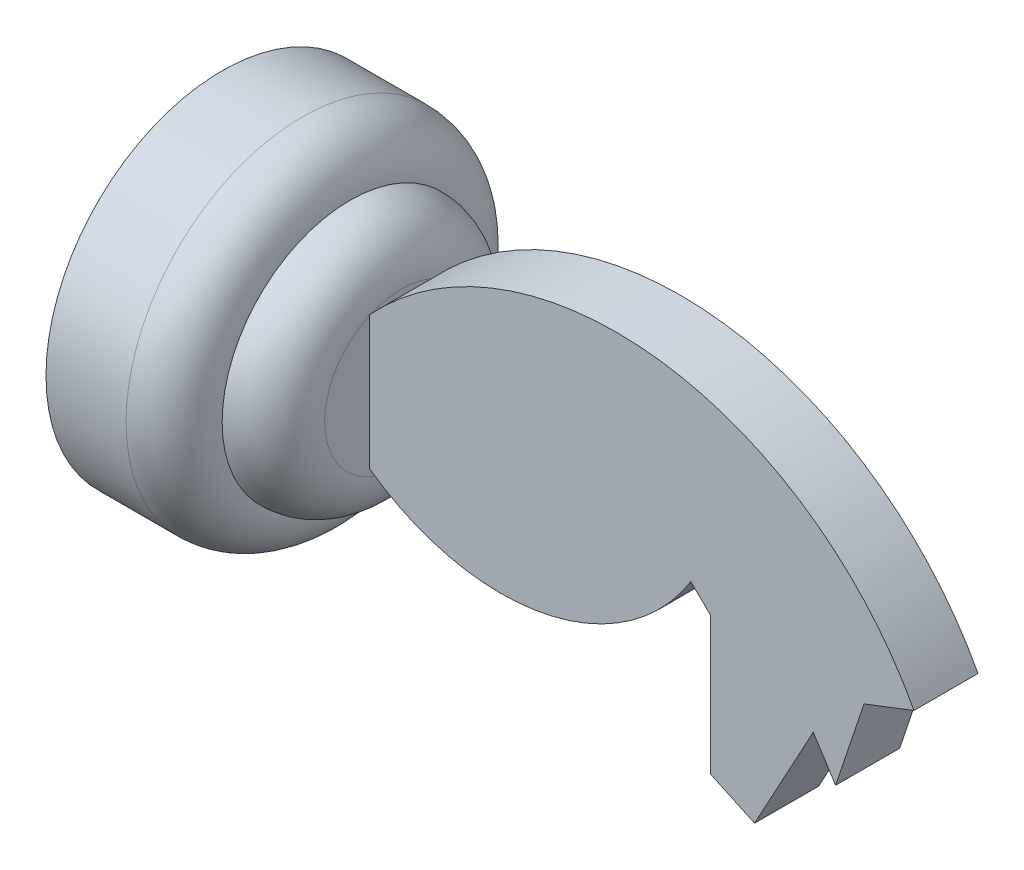
ISO-10303-21;
HEADER;
FILE_DESCRIPTION(('STEP AP214'),'2;1');
FILE_NAME('part.step','',(''),(''),'','','');
FILE_SCHEMA(('AUTOMOTIVE_DESIGN { 1 0 10303 214 1 1 1 1 }'));
ENDSEC;
DATA;
#1=APPLICATION_CONTEXT('core data for automotive mechanical design processes');
#2=APPLICATION_PROTOCOL_DEFINITION('international standard','automotive_design',2000,#1);
#3=PRODUCT_CONTEXT('',#1,'mechanical');
#4=PRODUCT('Part','Part','',(#3));
#5=PRODUCT_RELATED_PRODUCT_CATEGORY('part','',(#4));
#6=PRODUCT_DEFINITION_FORMATION('','',#4);
#7=PRODUCT_DEFINITION_CONTEXT('part definition',#1,'design');
#8=PRODUCT_DEFINITION('design','',#6,#7);
#9=PRODUCT_DEFINITION_SHAPE('','',#8);
#10=(LENGTH_UNIT() NAMED_UNIT(*) SI_UNIT(.MILLI.,.METRE.));
#11=(NAMED_UNIT(*) PLANE_ANGLE_UNIT() SI_UNIT($,.RADIAN.));
#12=(NAMED_UNIT(*) SI_UNIT($,.STERADIAN.) SOLID_ANGLE_UNIT());
#13=UNCERTAINTY_MEASURE_WITH_UNIT(LENGTH_MEASURE(1.E-05),#10,'distance_accuracy_value','');
#14=(GEOMETRIC_REPRESENTATION_CONTEXT(3) GLOBAL_UNCERTAINTY_ASSIGNED_CONTEXT((#13)) GLOBAL_UNIT_ASSIGNED_CONTEXT((#10,
#11,#12)) REPRESENTATION_CONTEXT('',''));
#15=CARTESIAN_POINT('',(0.,0.,0.));
#16=DIRECTION('',(0.,0.,1.));
#17=DIRECTION('',(1.,0.,0.));
#18=AXIS2_PLACEMENT_3D('',#15,#16,#17);
#19=CARTESIAN_POINT('',(11.2,0.,0.));
#20=DIRECTION('',(1.,0.,0.));
#21=DIRECTION('',(0.,0.,-1.));
#22=AXIS2_PLACEMENT_3D('',#19,#20,#21);
#23=PLANE('',#22);
#24=DIRECTION('',(0.,0.,-1.));
#25=VECTOR('',#24,1.);
#26=CARTESIAN_POINT('',(11.2,4.4,2.));
#27=LINE('',#26,#25);
#28=CARTESIAN_POINT('',(11.2,4.4,1.91833260932509));
#29=VERTEX_POINT('',#28);
#30=CARTESIAN_POINT('',(11.2,4.4,-1.91833260932509));
#31=VERTEX_POINT('',#30);
#32=EDGE_CURVE('E155',#29,#31,#27,.T.);
#33=ORIENTED_EDGE('',*,*,#32,.T.);
#34=CARTESIAN_POINT('',(11.2,0.,0.));
#35=DIRECTION('',(-1.,0.,0.));
#36=DIRECTION('',(0.,0.,1.));
#37=AXIS2_PLACEMENT_3D('',#34,#35,#36);
#38=CIRCLE('',#37,4.8);
#39=EDGE_CURVE('E55',#29,#31,#38,.T.);
#40=ORIENTED_EDGE('',*,*,#39,.F.);
#41=EDGE_LOOP('',(#33,#40));
#42=FACE_BOUND('',#41,.T.);
#43=ADVANCED_FACE('F46',(#42),#23,.T.);
#44=DIRECTION('',(0.,1.,0.));
#45=VECTOR('',#44,1.);
#46=CARTESIAN_POINT('',(11.2,0.,2.));
#47=LINE('',#46,#45);
#48=CARTESIAN_POINT('',(11.2,-3.91497825520678,2.));
#49=VERTEX_POINT('',#48);
#50=CARTESIAN_POINT('',(11.2,4.36348484585429,2.));
#51=VERTEX_POINT('',#50);
#52=EDGE_CURVE('E147',#49,#51,#47,.T.);
#53=ORIENTED_EDGE('',*,*,#52,.T.);
#54=CARTESIAN_POINT('',(11.2,4.36348484585429,-2.));
#55=VERTEX_POINT('',#54);
#56=EDGE_CURVE('E56',#55,#51,#38,.T.);
#57=ORIENTED_EDGE('',*,*,#56,.F.);
#58=DIRECTION('',(0.,1.,0.));
#59=VECTOR('',#58,1.);
#60=CARTESIAN_POINT('',(11.2,0.,-2.));
#61=LINE('',#60,#59);
#62=CARTESIAN_POINT('',(11.2,-3.91497825520678,-2.));
#63=VERTEX_POINT('',#62);
#64=EDGE_CURVE('E63',#63,#55,#61,.T.);
#65=ORIENTED_EDGE('',*,*,#64,.F.);
#66=DIRECTION('',(0.,0.,-1.));
#67=VECTOR('',#66,1.);
#68=CARTESIAN_POINT('',(11.2,-3.91497825520678,2.));
#69=LINE('',#68,#67);
#70=EDGE_CURVE('E225',#49,#63,#69,.T.);
#71=ORIENTED_EDGE('',*,*,#70,.F.);
#72=EDGE_LOOP('',(#53,#57,#65,#71));
#73=FACE_BOUND('',#72,.T.);
#74=ADVANCED_FACE('F48',(#73),#23,.T.);
#75=CARTESIAN_POINT('',(8.,0.,0.));
#76=DIRECTION('',(-1.,0.,0.));
#77=DIRECTION('',(0.,0.,1.));
#78=AXIS2_PLACEMENT_3D('',#75,#76,#77);
#79=TOROIDAL_SURFACE('',#78,4.8,3.2);
#80=CARTESIAN_POINT('',(8.,0.,0.));
#81=DIRECTION('',(-1.,0.,0.));
#82=DIRECTION('',(0.,0.,1.));
#83=AXIS2_PLACEMENT_3D('',#80,#81,#82);
#84=CIRCLE('',#83,8.);
#85=CARTESIAN_POINT('',(8.,0.,8.));
#86=VERTEX_POINT('',#85);
#87=EDGE_CURVE('E237',#86,#86,#84,.T.);
#88=ORIENTED_EDGE('',*,*,#87,.F.);
#89=EDGE_LOOP('',(#88));
#90=FACE_BOUND('',#89,.T.);
#91=EDGE_CURVE('E11',#51,#29,#38,.T.);
#92=ORIENTED_EDGE('',*,*,#91,.T.);
#93=ORIENTED_EDGE('',*,*,#39,.T.);
#94=EDGE_CURVE('E70',#31,#55,#38,.T.);
#95=ORIENTED_EDGE('',*,*,#94,.T.);
#96=ORIENTED_EDGE('',*,*,#56,.T.);
#97=EDGE_LOOP('',(#92,#93,#95,#96));
#98=FACE_BOUND('',#97,.T.);
#99=ADVANCED_FACE('F245',(#90,#98),#79,.T.);
#100=CARTESIAN_POINT('',(5.,0.,0.));
#101=DIRECTION('',(-1.,0.,0.));
#102=DIRECTION('',(0.,0.,1.));
#103=AXIS2_PLACEMENT_3D('',#100,#101,#102);
#104=TOROIDAL_SURFACE('',#103,8.,3.);
#105=CARTESIAN_POINT('',(5.,0.,0.));
#106=DIRECTION('',(-1.,0.,0.));
#107=DIRECTION('',(0.,0.,1.));
#108=AXIS2_PLACEMENT_3D('',#105,#106,#107);
#109=CIRCLE('',#108,11.);
#110=CARTESIAN_POINT('',(5.,0.,11.));
#111=VERTEX_POINT('',#110);
#112=EDGE_CURVE('E235',#111,#111,#109,.T.);
#113=ORIENTED_EDGE('',*,*,#112,.F.);
#114=EDGE_LOOP('',(#113));
#115=FACE_BOUND('',#114,.T.);
#116=ORIENTED_EDGE('',*,*,#87,.T.);
#117=EDGE_LOOP('',(#116));
#118=FACE_BOUND('',#117,.T.);
#119=ADVANCED_FACE('F293',(#115,#118),#104,.T.);
#120=CARTESIAN_POINT('',(0.,0.,0.));
#121=DIRECTION('',(-1.,0.,0.));
#122=DIRECTION('',(0.,0.,1.));
#123=AXIS2_PLACEMENT_3D('',#120,#121,#122);
#124=CYLINDRICAL_SURFACE('',#123,11.);
#125=ORIENTED_EDGE('',*,*,#112,.T.);
#126=EDGE_LOOP('',(#125));
#127=FACE_BOUND('',#126,.T.);
#128=CARTESIAN_POINT('',(0.,0.,0.));
#129=DIRECTION('',(-1.,0.,0.));
#130=DIRECTION('',(0.,0.,1.));
#131=AXIS2_PLACEMENT_3D('',#128,#129,#130);
#132=CIRCLE('',#131,11.);
#133=CARTESIAN_POINT('',(0.,0.,11.));
#134=VERTEX_POINT('',#133);
#135=EDGE_CURVE('E232',#134,#134,#132,.T.);
#136=ORIENTED_EDGE('',*,*,#135,.F.);
#137=EDGE_LOOP('',(#136));
#138=FACE_BOUND('',#137,.T.);
#139=ADVANCED_FACE('F334',(#127,#138),#124,.T.);
#140=CARTESIAN_POINT('',(0.,0.,0.));
#141=DIRECTION('',(-1.,0.,0.));
#142=DIRECTION('',(0.,0.,1.));
#143=AXIS2_PLACEMENT_3D('',#140,#141,#142);
#144=PLANE('',#143);
#145=ORIENTED_EDGE('',*,*,#135,.T.);
#146=EDGE_LOOP('',(#145));
#147=FACE_BOUND('',#146,.T.);
#148=ADVANCED_FACE('F331',(#147),#144,.T.);
#149=CARTESIAN_POINT('',(11.2,0.,2.));
#150=DIRECTION('',(-1.,0.,0.));
#151=DIRECTION('',(0.,0.,1.));
#152=AXIS2_PLACEMENT_3D('',#149,#150,#151);
#153=PLANE('',#152);
#154=ORIENTED_EDGE('',*,*,#91,.F.);
#155=CARTESIAN_POINT('',(11.2,4.4,2.));
#156=VERTEX_POINT('',#155);
#157=EDGE_CURVE('E139',#51,#156,#47,.T.);
#158=ORIENTED_EDGE('',*,*,#157,.T.);
#159=EDGE_CURVE('E142',#156,#29,#27,.T.);
#160=ORIENTED_EDGE('',*,*,#159,.T.);
#161=EDGE_LOOP('',(#154,#158,#160));
#162=FACE_BOUND('',#161,.T.);
#163=ADVANCED_FACE('F141',(#162),#153,.T.);
#164=CARTESIAN_POINT('',(26.6430950023222,-9.83062952751044,2.));
#165=DIRECTION('',(0.,0.,-1.));
#166=DIRECTION('',(-1.,0.,0.));
#167=AXIS2_PLACEMENT_3D('',#164,#165,#166);
#168=CYLINDRICAL_SURFACE('',#167,21.);
#169=CARTESIAN_POINT('',(26.6430950023222,-9.83062952751044,-2.));
#170=DIRECTION('',(0.,0.,1.));
#171=DIRECTION('',(1.,0.,0.));
#172=AXIS2_PLACEMENT_3D('',#169,#170,#171);
#173=CIRCLE('',#172,21.);
#174=CARTESIAN_POINT('',(11.2,4.4,-2.));
#175=VERTEX_POINT('',#174);
#176=CARTESIAN_POINT('',(45.2,0.,-2.));
#177=VERTEX_POINT('',#176);
#178=EDGE_CURVE('E186',#175,#177,#173,.F.);
#179=ORIENTED_EDGE('',*,*,#178,.F.);
#180=EDGE_CURVE('E158',#31,#175,#27,.T.);
#181=ORIENTED_EDGE('',*,*,#180,.F.);
#182=ORIENTED_EDGE('',*,*,#32,.F.);
#183=ORIENTED_EDGE('',*,*,#159,.F.);
#184=CARTESIAN_POINT('',(26.6430950023222,-9.83062952751044,2.));
#185=DIRECTION('',(0.,0.,1.));
#186=DIRECTION('',(1.,0.,0.));
#187=AXIS2_PLACEMENT_3D('',#184,#185,#186);
#188=CIRCLE('',#187,21.);
#189=CARTESIAN_POINT('',(45.2,0.,2.));
#190=VERTEX_POINT('',#189);
#191=EDGE_CURVE('E148',#156,#190,#188,.F.);
#192=ORIENTED_EDGE('',*,*,#191,.T.);
#193=DIRECTION('',(0.,0.,-1.));
#194=VECTOR('',#193,1.);
#195=CARTESIAN_POINT('',(45.2,0.,2.));
#196=LINE('',#195,#194);
#197=EDGE_CURVE('E185',#190,#177,#196,.T.);
#198=ORIENTED_EDGE('',*,*,#197,.T.);
#199=EDGE_LOOP('',(#179,#181,#182,#183,#192,#198));
#200=FACE_BOUND('',#199,.T.);
#201=ADVANCED_FACE('F153',(#200),#168,.T.);
#202=ORIENTED_EDGE('',*,*,#94,.F.);
#203=ORIENTED_EDGE('',*,*,#180,.T.);
#204=EDGE_CURVE('E189',#55,#175,#61,.T.);
#205=ORIENTED_EDGE('',*,*,#204,.F.);
#206=EDGE_LOOP('',(#202,#203,#205));
#207=FACE_BOUND('',#206,.T.);
#208=ADVANCED_FACE('F247',(#207),#153,.T.);
#209=CARTESIAN_POINT('',(19.3994308478551,7.43267937847441,2.));
#210=DIRECTION('',(0.,0.,-1.));
#211=DIRECTION('',(-1.,0.,0.));
#212=AXIS2_PLACEMENT_3D('',#209,#210,#211);
#213=CYLINDRICAL_SURFACE('',#212,14.);
#214=CARTESIAN_POINT('',(19.3994308478551,7.43267937847441,-2.));
#215=DIRECTION('',(0.,0.,1.));
#216=DIRECTION('',(1.,0.,0.));
#217=AXIS2_PLACEMENT_3D('',#214,#215,#216);
#218=CIRCLE('',#217,14.);
#219=CARTESIAN_POINT('',(31.263463773332,0.,-2.));
#220=VERTEX_POINT('',#219);
#221=EDGE_CURVE('E191',#220,#63,#218,.F.);
#222=ORIENTED_EDGE('',*,*,#221,.F.);
#223=DIRECTION('',(0.,0.,-1.));
#224=VECTOR('',#223,1.);
#225=CARTESIAN_POINT('',(31.263463773332,0.,2.));
#226=LINE('',#225,#224);
#227=CARTESIAN_POINT('',(31.263463773332,0.,2.));
#228=VERTEX_POINT('',#227);
#229=EDGE_CURVE('E223',#228,#220,#226,.T.);
#230=ORIENTED_EDGE('',*,*,#229,.F.);
#231=CARTESIAN_POINT('',(19.3994308478551,7.43267937847441,2.));
#232=DIRECTION('',(0.,0.,1.));
#233=DIRECTION('',(1.,0.,0.));
#234=AXIS2_PLACEMENT_3D('',#231,#232,#233);
#235=CIRCLE('',#234,14.);
#236=EDGE_CURVE('E169',#228,#49,#235,.F.);
#237=ORIENTED_EDGE('',*,*,#236,.T.);
#238=ORIENTED_EDGE('',*,*,#70,.T.);
#239=EDGE_LOOP('',(#222,#230,#237,#238));
#240=FACE_BOUND('',#239,.T.);
#241=ADVANCED_FACE('F285',(#240),#213,.T.);
#242=CARTESIAN_POINT('',(15.1403569656046,15.6240069272758,2.));
#243=DIRECTION('',(0.695904285191115,0.71813454578696,0.));
#244=DIRECTION('',(-0.71813454578696,0.695904285191115,0.));
#245=AXIS2_PLACEMENT_3D('',#242,#243,#244);
#246=PLANE('',#245);
#247=DIRECTION('',(0.71813454578696,-0.695904285191115,0.));
#248=VECTOR('',#247,1.);
#249=CARTESIAN_POINT('',(15.1403569656046,15.6240069272758,-2.));
#250=LINE('',#249,#248);
#251=CARTESIAN_POINT('',(32.498964702066,-1.19725529945281,-2.));
#252=VERTEX_POINT('',#251);
#253=EDGE_CURVE('E193',#220,#252,#250,.T.);
#254=ORIENTED_EDGE('',*,*,#253,.T.);
#255=DIRECTION('',(0.,0.,-1.));
#256=VECTOR('',#255,1.);
#257=CARTESIAN_POINT('',(32.498964702066,-1.19725529945281,2.));
#258=LINE('',#257,#256);
#259=CARTESIAN_POINT('',(32.498964702066,-1.19725529945281,2.));
#260=VERTEX_POINT('',#259);
#261=EDGE_CURVE('E220',#260,#252,#258,.T.);
#262=ORIENTED_EDGE('',*,*,#261,.F.);
#263=DIRECTION('',(0.71813454578696,-0.695904285191115,0.));
#264=VECTOR('',#263,1.);
#265=CARTESIAN_POINT('',(15.1403569656046,15.6240069272758,2.));
#266=LINE('',#265,#264);
#267=EDGE_CURVE('E172',#228,#260,#266,.T.);
#268=ORIENTED_EDGE('',*,*,#267,.F.);
#269=ORIENTED_EDGE('',*,*,#229,.T.);
#270=EDGE_LOOP('',(#254,#262,#268,#269));
#271=FACE_BOUND('',#270,.T.);
#272=ADVANCED_FACE('F281',(#271),#246,.F.);
#273=CARTESIAN_POINT('',(32.498964702066,0.,2.));
#274=DIRECTION('',(1.,0.,0.));
#275=DIRECTION('',(0.,0.,-1.));
#276=AXIS2_PLACEMENT_3D('',#273,#274,#275);
#277=PLANE('',#276);
#278=DIRECTION('',(0.,-1.,0.));
#279=VECTOR('',#278,1.);
#280=CARTESIAN_POINT('',(32.498964702066,0.,-2.));
#281=LINE('',#280,#279);
#282=CARTESIAN_POINT('',(32.498964702066,-9.79725529945281,-2.));
#283=VERTEX_POINT('',#282);
#284=EDGE_CURVE('E195',#252,#283,#281,.T.);
#285=ORIENTED_EDGE('',*,*,#284,.T.);
#286=DIRECTION('',(0.,0.,-1.));
#287=VECTOR('',#286,1.);
#288=CARTESIAN_POINT('',(32.498964702066,-9.79725529945281,2.));
#289=LINE('',#288,#287);
#290=CARTESIAN_POINT('',(32.498964702066,-9.79725529945281,2.));
#291=VERTEX_POINT('',#290);
#292=EDGE_CURVE('E217',#291,#283,#289,.T.);
#293=ORIENTED_EDGE('',*,*,#292,.F.);
#294=DIRECTION('',(0.,-1.,0.));
#295=VECTOR('',#294,1.);
#296=CARTESIAN_POINT('',(32.498964702066,0.,2.));
#297=LINE('',#296,#295);
#298=EDGE_CURVE('E174',#260,#291,#297,.T.);
#299=ORIENTED_EDGE('',*,*,#298,.F.);
#300=ORIENTED_EDGE('',*,*,#261,.T.);
#301=EDGE_LOOP('',(#285,#293,#299,#300));
#302=FACE_BOUND('',#301,.T.);
#303=ADVANCED_FACE('F277',(#302),#277,.F.);
#304=CARTESIAN_POINT('',(1.99946445082386,4.3197897508319,2.));
#305=DIRECTION('',(0.420047755956167,0.907502001494316,0.));
#306=DIRECTION('',(-0.907502001494316,0.420047755956167,0.));
#307=AXIS2_PLACEMENT_3D('',#304,#305,#306);
#308=PLANE('',#307);
#309=DIRECTION('',(0.907502001494316,-0.420047755956167,0.));
#310=VECTOR('',#309,1.);
#311=CARTESIAN_POINT('',(1.99946445082386,4.3197897508319,-2.));
#312=LINE('',#311,#310);
#313=CARTESIAN_POINT('',(35.2486957665938,-11.07,-2.));
#314=VERTEX_POINT('',#313);
#315=EDGE_CURVE('E197',#283,#314,#312,.T.);
#316=ORIENTED_EDGE('',*,*,#315,.T.);
#317=DIRECTION('',(0.,0.,-1.));
#318=VECTOR('',#317,1.);
#319=CARTESIAN_POINT('',(35.2486957665938,-11.07,2.));
#320=LINE('',#319,#318);
#321=CARTESIAN_POINT('',(35.2486957665938,-11.07,2.));
#322=VERTEX_POINT('',#321);
#323=EDGE_CURVE('E214',#322,#314,#320,.T.);
#324=ORIENTED_EDGE('',*,*,#323,.F.);
#325=DIRECTION('',(0.907502001494316,-0.420047755956167,0.));
#326=VECTOR('',#325,1.);
#327=CARTESIAN_POINT('',(1.99946445082386,4.3197897508319,2.));
#328=LINE('',#327,#326);
#329=EDGE_CURVE('E176',#291,#322,#328,.T.);
#330=ORIENTED_EDGE('',*,*,#329,.F.);
#331=ORIENTED_EDGE('',*,*,#292,.T.);
#332=EDGE_LOOP('',(#316,#324,#330,#331));
#333=FACE_BOUND('',#332,.T.);
#334=ADVANCED_FACE('F272',(#333),#308,.F.);
#335=CARTESIAN_POINT('',(31.8696932080387,-17.2961223907554,2.));
#336=DIRECTION('',(-0.87890625,0.47699455312502,0.));
#337=DIRECTION('',(-0.47699455312502,-0.87890625,0.));
#338=AXIS2_PLACEMENT_3D('',#335,#336,#337);
#339=PLANE('',#338);
#340=DIRECTION('',(0.47699455312502,0.87890625,0.));
#341=VECTOR('',#340,1.);
#342=CARTESIAN_POINT('',(31.8696932080387,-17.2961223907554,-2.));
#343=LINE('',#342,#341);
#344=CARTESIAN_POINT('',(38.9120139345939,-4.32,-2.));
#345=VERTEX_POINT('',#344);
#346=EDGE_CURVE('E199',#314,#345,#343,.T.);
#347=ORIENTED_EDGE('',*,*,#346,.T.);
#348=DIRECTION('',(0.,0.,-1.));
#349=VECTOR('',#348,1.);
#350=CARTESIAN_POINT('',(38.9120139345939,-4.32,2.));
#351=LINE('',#350,#349);
#352=CARTESIAN_POINT('',(38.9120139345939,-4.32,2.));
#353=VERTEX_POINT('',#352);
#354=EDGE_CURVE('E211',#353,#345,#351,.T.);
#355=ORIENTED_EDGE('',*,*,#354,.F.);
#356=DIRECTION('',(0.47699455312502,0.87890625,0.));
#357=VECTOR('',#356,1.);
#358=CARTESIAN_POINT('',(31.8696932080387,-17.2961223907554,2.));
#359=LINE('',#358,#357);
#360=EDGE_CURVE('E178',#322,#353,#359,.T.);
#361=ORIENTED_EDGE('',*,*,#360,.F.);
#362=ORIENTED_EDGE('',*,*,#323,.T.);
#363=EDGE_LOOP('',(#347,#355,#361,#362));
#364=FACE_BOUND('',#363,.T.);
#365=ADVANCED_FACE('F266',(#364),#339,.F.);
#366=CARTESIAN_POINT('',(25.561946300607,16.4389062035767,2.));
#367=DIRECTION('',(0.84108527131783,0.540902547943909,0.));
#368=DIRECTION('',(-0.540902547943909,0.84108527131783,0.));
#369=AXIS2_PLACEMENT_3D('',#366,#367,#368);
#370=PLANE('',#369);
#371=DIRECTION('',(0.540902547943909,-0.84108527131783,0.));
#372=VECTOR('',#371,1.);
#373=CARTESIAN_POINT('',(25.561946300607,16.4389062035767,-2.));
#374=LINE('',#373,#372);
#375=CARTESIAN_POINT('',(40.3075425082892,-6.49,-2.));
#376=VERTEX_POINT('',#375);
#377=EDGE_CURVE('E201',#345,#376,#374,.T.);
#378=ORIENTED_EDGE('',*,*,#377,.T.);
#379=DIRECTION('',(0.,0.,-1.));
#380=VECTOR('',#379,1.);
#381=CARTESIAN_POINT('',(40.3075425082892,-6.49,2.));
#382=LINE('',#381,#380);
#383=CARTESIAN_POINT('',(40.3075425082892,-6.49,2.));
#384=VERTEX_POINT('',#383);
#385=EDGE_CURVE('E208',#384,#376,#382,.T.);
#386=ORIENTED_EDGE('',*,*,#385,.F.);
#387=DIRECTION('',(0.540902547943909,-0.84108527131783,0.));
#388=VECTOR('',#387,1.);
#389=CARTESIAN_POINT('',(25.561946300607,16.4389062035767,2.));
#390=LINE('',#389,#388);
#391=EDGE_CURVE('E180',#353,#384,#390,.T.);
#392=ORIENTED_EDGE('',*,*,#391,.F.);
#393=ORIENTED_EDGE('',*,*,#354,.T.);
#394=EDGE_LOOP('',(#378,#386,#392,#393));
#395=FACE_BOUND('',#394,.T.);
#396=ADVANCED_FACE('F262',(#395),#370,.F.);
#397=CARTESIAN_POINT('',(38.1844392608772,-12.8157644415364,2.));
#398=DIRECTION('',(-0.948028673835126,0.318184904711731,0.));
#399=DIRECTION('',(-0.318184904711731,-0.948028673835126,0.));
#400=AXIS2_PLACEMENT_3D('',#397,#398,#399);
#401=PLANE('',#400);
#402=DIRECTION('',(0.318184904711731,0.948028673835126,0.));
#403=VECTOR('',#402,1.);
#404=CARTESIAN_POINT('',(38.1844392608772,-12.8157644415364,-2.));
#405=LINE('',#404,#403);
#406=CARTESIAN_POINT('',(42.0830142765807,-1.2,-2.));
#407=VERTEX_POINT('',#406);
#408=EDGE_CURVE('E166',#376,#407,#405,.T.);
#409=ORIENTED_EDGE('',*,*,#408,.T.);
#410=DIRECTION('',(0.,0.,-1.));
#411=VECTOR('',#410,1.);
#412=CARTESIAN_POINT('',(42.0830142765807,-1.2,2.));
#413=LINE('',#412,#411);
#414=CARTESIAN_POINT('',(42.0830142765807,-1.2,2.));
#415=VERTEX_POINT('',#414);
#416=EDGE_CURVE('E205',#415,#407,#413,.T.);
#417=ORIENTED_EDGE('',*,*,#416,.F.);
#418=DIRECTION('',(0.318184904711731,0.948028673835126,0.));
#419=VECTOR('',#418,1.);
#420=CARTESIAN_POINT('',(38.1844392608772,-12.8157644415364,2.));
#421=LINE('',#420,#419);
#422=EDGE_CURVE('E182',#384,#415,#421,.T.);
#423=ORIENTED_EDGE('',*,*,#422,.F.);
#424=ORIENTED_EDGE('',*,*,#385,.T.);
#425=EDGE_LOOP('',(#409,#417,#423,#424));
#426=FACE_BOUND('',#425,.T.);
#427=ADVANCED_FACE('F257',(#426),#401,.F.);
#428=CARTESIAN_POINT('',(5.83455842805408,-15.1551961022505,2.));
#429=DIRECTION('',(-0.359281437125749,0.933229258508785,0.));
#430=DIRECTION('',(-0.933229258508785,-0.359281437125749,0.));
#431=AXIS2_PLACEMENT_3D('',#428,#429,#430);
#432=PLANE('',#431);
#433=DIRECTION('',(0.933229258508785,0.359281437125749,0.));
#434=VECTOR('',#433,1.);
#435=CARTESIAN_POINT('',(5.83455842805408,-15.1551961022505,-2.));
#436=LINE('',#435,#434);
#437=EDGE_CURVE('E163',#407,#177,#436,.T.);
#438=ORIENTED_EDGE('',*,*,#437,.T.);
#439=ORIENTED_EDGE('',*,*,#197,.F.);
#440=DIRECTION('',(0.933229258508785,0.359281437125749,0.));
#441=VECTOR('',#440,1.);
#442=CARTESIAN_POINT('',(5.83455842805408,-15.1551961022505,2.));
#443=LINE('',#442,#441);
#444=EDGE_CURVE('E161',#415,#190,#443,.T.);
#445=ORIENTED_EDGE('',*,*,#444,.F.);
#446=ORIENTED_EDGE('',*,*,#416,.T.);
#447=EDGE_LOOP('',(#438,#439,#445,#446));
#448=FACE_BOUND('',#447,.T.);
#449=ADVANCED_FACE('F251',(#448),#432,.F.);
#450=CARTESIAN_POINT('',(0.,0.,2.));
#451=DIRECTION('',(0.,0.,1.));
#452=DIRECTION('',(1.,0.,0.));
#453=AXIS2_PLACEMENT_3D('',#450,#451,#452);
#454=PLANE('',#453);
#455=ORIENTED_EDGE('',*,*,#191,.F.);
#456=ORIENTED_EDGE('',*,*,#157,.F.);
#457=ORIENTED_EDGE('',*,*,#52,.F.);
#458=ORIENTED_EDGE('',*,*,#236,.F.);
#459=ORIENTED_EDGE('',*,*,#267,.T.);
#460=ORIENTED_EDGE('',*,*,#298,.T.);
#461=ORIENTED_EDGE('',*,*,#329,.T.);
#462=ORIENTED_EDGE('',*,*,#360,.T.);
#463=ORIENTED_EDGE('',*,*,#391,.T.);
#464=ORIENTED_EDGE('',*,*,#422,.T.);
#465=ORIENTED_EDGE('',*,*,#444,.T.);
#466=EDGE_LOOP('',(#455,#456,#457,#458,#459,#460,#461,#462,#463,#464,#465));
#467=FACE_BOUND('',#466,.T.);
#468=ADVANCED_FACE('F159',(#467),#454,.T.);
#469=CARTESIAN_POINT('',(0.,0.,-2.));
#470=DIRECTION('',(0.,0.,1.));
#471=DIRECTION('',(1.,0.,0.));
#472=AXIS2_PLACEMENT_3D('',#469,#470,#471);
#473=PLANE('',#472);
#474=ORIENTED_EDGE('',*,*,#178,.T.);
#475=ORIENTED_EDGE('',*,*,#437,.F.);
#476=ORIENTED_EDGE('',*,*,#408,.F.);
#477=ORIENTED_EDGE('',*,*,#377,.F.);
#478=ORIENTED_EDGE('',*,*,#346,.F.);
#479=ORIENTED_EDGE('',*,*,#315,.F.);
#480=ORIENTED_EDGE('',*,*,#284,.F.);
#481=ORIENTED_EDGE('',*,*,#253,.F.);
#482=ORIENTED_EDGE('',*,*,#221,.T.);
#483=ORIENTED_EDGE('',*,*,#64,.T.);
#484=ORIENTED_EDGE('',*,*,#204,.T.);
#485=EDGE_LOOP('',(#474,#475,#476,#477,#478,#479,#480,#481,#482,#483,#484));
#486=FACE_BOUND('',#485,.T.);
#487=ADVANCED_FACE('F248',(#486),#473,.F.);
#488=CLOSED_SHELL('',(#43,#74,#99,#119,#139,#148,#163,#201,#208,#241,#272,#303,#334,#365,#396,
#427,#449,#468,#487));
#489=CARTESIAN_POINT('',(1.,0.,0.));
#490=DIRECTION('',(-1.,0.,0.));
#491=DIRECTION('',(0.,0.,1.));
#492=AXIS2_PLACEMENT_3D('',#489,#490,#491);
#493=PLANE('',#492);
#494=CARTESIAN_POINT('',(1.,0.,0.));
#495=DIRECTION('',(-1.,0.,0.));
#496=DIRECTION('',(0.,0.,1.));
#497=AXIS2_PLACEMENT_3D('',#494,#495,#496);
#498=CIRCLE('',#497,5.25);
#499=CARTESIAN_POINT('',(1.,0.,5.25));
#500=VERTEX_POINT('',#499);
#501=EDGE_CURVE('E229',#500,#500,#498,.T.);
#502=ORIENTED_EDGE('',*,*,#501,.F.);
#503=EDGE_LOOP('',(#502));
#504=FACE_BOUND('',#503,.T.);
#505=ADVANCED_FACE('F316',(#504),#493,.F.);
#506=CARTESIAN_POINT('',(0.,0.,0.));
#507=DIRECTION('',(-1.,0.,0.));
#508=DIRECTION('',(0.,0.,1.));
#509=AXIS2_PLACEMENT_3D('',#506,#507,#508);
#510=CYLINDRICAL_SURFACE('',#509,5.25);
#511=CARTESIAN_POINT('',(3.5,0.,0.));
#512=DIRECTION('',(-1.,0.,0.));
#513=DIRECTION('',(0.,0.,1.));
#514=AXIS2_PLACEMENT_3D('',#511,#512,#513);
#515=CIRCLE('',#514,5.25);
#516=CARTESIAN_POINT('',(3.5,0.,5.25));
#517=VERTEX_POINT('',#516);
#518=EDGE_CURVE('E156',#517,#517,#515,.T.);
#519=ORIENTED_EDGE('',*,*,#518,.F.);
#520=EDGE_LOOP('',(#519));
#521=FACE_BOUND('',#520,.T.);
#522=ORIENTED_EDGE('',*,*,#501,.T.);
#523=EDGE_LOOP('',(#522));
#524=FACE_BOUND('',#523,.T.);
#525=ADVANCED_FACE('F306',(#521,#524),#510,.F.);
#526=CARTESIAN_POINT('',(3.5,0.,0.));
#527=DIRECTION('',(1.,0.,0.));
#528=DIRECTION('',(0.,0.,-1.));
#529=AXIS2_PLACEMENT_3D('',#526,#527,#528);
#530=PLANE('',#529);
#531=ORIENTED_EDGE('',*,*,#518,.T.);
#532=EDGE_LOOP('',(#531));
#533=FACE_BOUND('',#532,.T.);
#534=ADVANCED_FACE('F302',(#533),#530,.F.);
#535=CLOSED_SHELL('',(#505,#525,#534));
#536=ORIENTED_CLOSED_SHELL('',*,#535,.T.);
#537=BREP_WITH_VOIDS('B2',#488,(#536));
#538=ADVANCED_BREP_SHAPE_REPRESENTATION('',(#18,#537),#14);
#539=SHAPE_DEFINITION_REPRESENTATION(#9,#538);
ENDSEC;
END-ISO-10303-21;
